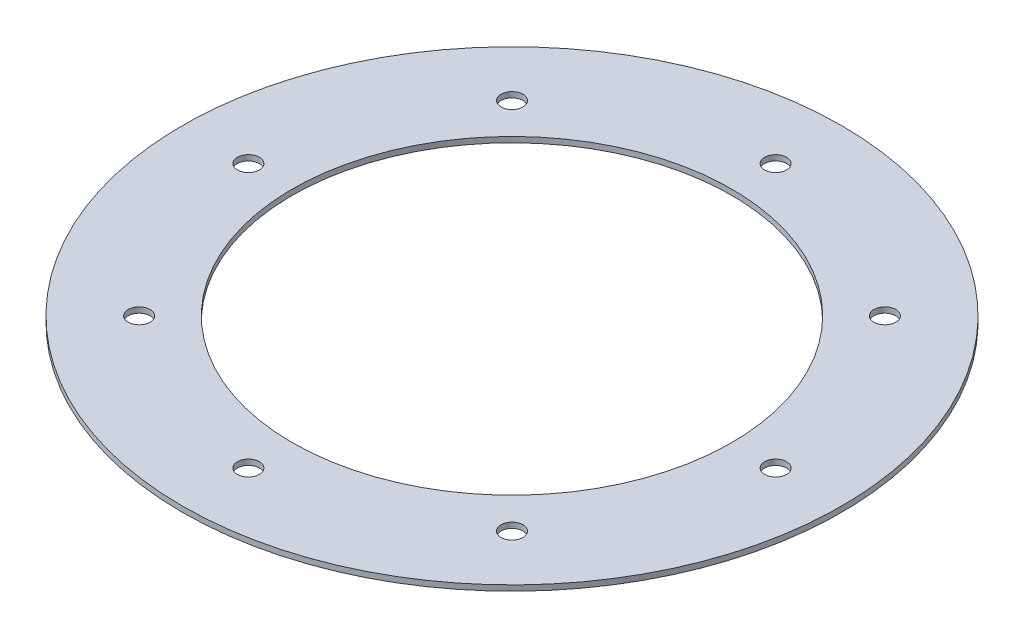
ISO-10303-21;
HEADER;
FILE_DESCRIPTION(('STEP AP214'),'2;1');
FILE_NAME('part.step','',(''),(''),'','','');
FILE_SCHEMA(('AUTOMOTIVE_DESIGN { 1 0 10303 214 1 1 1 1 }'));
ENDSEC;
DATA;
#1=APPLICATION_CONTEXT('core data for automotive mechanical design processes');
#2=APPLICATION_PROTOCOL_DEFINITION('international standard','automotive_design',2000,#1);
#3=PRODUCT_CONTEXT('',#1,'mechanical');
#4=PRODUCT('Part','Part','',(#3));
#5=PRODUCT_RELATED_PRODUCT_CATEGORY('part','',(#4));
#6=PRODUCT_DEFINITION_FORMATION('','',#4);
#7=PRODUCT_DEFINITION_CONTEXT('part definition',#1,'design');
#8=PRODUCT_DEFINITION('design','',#6,#7);
#9=PRODUCT_DEFINITION_SHAPE('','',#8);
#10=(LENGTH_UNIT() NAMED_UNIT(*) SI_UNIT(.MILLI.,.METRE.));
#11=(NAMED_UNIT(*) PLANE_ANGLE_UNIT() SI_UNIT($,.RADIAN.));
#12=(NAMED_UNIT(*) SI_UNIT($,.STERADIAN.) SOLID_ANGLE_UNIT());
#13=UNCERTAINTY_MEASURE_WITH_UNIT(LENGTH_MEASURE(1.E-05),#10,'distance_accuracy_value','');
#14=(GEOMETRIC_REPRESENTATION_CONTEXT(3) GLOBAL_UNCERTAINTY_ASSIGNED_CONTEXT((#13)) GLOBAL_UNIT_ASSIGNED_CONTEXT((#10,
#11,#12)) REPRESENTATION_CONTEXT('',''));
#15=CARTESIAN_POINT('',(0.,0.,0.));
#16=DIRECTION('',(0.,0.,1.));
#17=DIRECTION('',(1.,0.,0.));
#18=AXIS2_PLACEMENT_3D('',#15,#16,#17);
#19=CARTESIAN_POINT('',(0.,1.,0.));
#20=DIRECTION('',(0.,1.,0.));
#21=DIRECTION('',(0.,0.,1.));
#22=AXIS2_PLACEMENT_3D('',#19,#20,#21);
#23=PLANE('',#22);
#24=CARTESIAN_POINT('',(-47.999999999998,1.,2.04342392667114E-12));
#25=DIRECTION('',(0.,1.,0.));
#26=DIRECTION('',(0.,0.,1.));
#27=AXIS2_PLACEMENT_3D('',#24,#25,#26);
#28=CIRCLE('',#27,2.00000000000303);
#29=CARTESIAN_POINT('',(-47.999999999998,1.,2.00000000000507));
#30=VERTEX_POINT('',#29);
#31=EDGE_CURVE('E108',#30,#30,#28,.T.);
#32=ORIENTED_EDGE('',*,*,#31,.F.);
#33=EDGE_LOOP('',(#32));
#34=FACE_BOUND('',#33,.T.);
#35=CARTESIAN_POINT('',(4.07509124407046E-12,1.,48.));
#36=DIRECTION('',(0.,1.,0.));
#37=DIRECTION('',(0.,0.,1.));
#38=AXIS2_PLACEMENT_3D('',#35,#36,#37);
#39=CIRCLE('',#38,2.00000000000422);
#40=CARTESIAN_POINT('',(4.07509124407046E-12,1.,50.0000000000042));
#41=VERTEX_POINT('',#40);
#42=EDGE_CURVE('E92',#41,#41,#39,.T.);
#43=ORIENTED_EDGE('',*,*,#42,.F.);
#44=EDGE_LOOP('',(#43));
#45=FACE_BOUND('',#44,.T.);
#46=CARTESIAN_POINT('',(48.000000000002,1.,-2.03754562203523E-12));
#47=DIRECTION('',(0.,1.,0.));
#48=DIRECTION('',(0.,0.,1.));
#49=AXIS2_PLACEMENT_3D('',#46,#47,#48);
#50=CIRCLE('',#49,2.00000000000152);
#51=CARTESIAN_POINT('',(48.000000000002,1.,1.99999999999948));
#52=VERTEX_POINT('',#51);
#53=EDGE_CURVE('E76',#52,#52,#50,.T.);
#54=ORIENTED_EDGE('',*,*,#53,.F.);
#55=EDGE_LOOP('',(#54));
#56=FACE_BOUND('',#55,.T.);
#57=CARTESIAN_POINT('',(0.,1.,0.));
#58=DIRECTION('',(0.,1.,0.));
#59=DIRECTION('',(0.,0.,1.));
#60=AXIS2_PLACEMENT_3D('',#57,#58,#59);
#61=CIRCLE('',#60,40.);
#62=CARTESIAN_POINT('',(0.,1.,40.));
#63=VERTEX_POINT('',#62);
#64=EDGE_CURVE('E60',#63,#63,#61,.T.);
#65=ORIENTED_EDGE('',*,*,#64,.F.);
#66=EDGE_LOOP('',(#65));
#67=FACE_BOUND('',#66,.T.);
#68=CARTESIAN_POINT('',(0.,1.,0.));
#69=DIRECTION('',(0.,1.,0.));
#70=DIRECTION('',(0.,0.,1.));
#71=AXIS2_PLACEMENT_3D('',#68,#69,#70);
#72=CIRCLE('',#71,60.);
#73=CARTESIAN_POINT('',(0.,1.,60.));
#74=VERTEX_POINT('',#73);
#75=EDGE_CURVE('E10',#74,#74,#72,.T.);
#76=ORIENTED_EDGE('',*,*,#75,.T.);
#77=EDGE_LOOP('',(#76));
#78=FACE_BOUND('',#77,.T.);
#79=CARTESIAN_POINT('',(0.,1.,-48.));
#80=DIRECTION('',(0.,1.,0.));
#81=DIRECTION('',(0.,0.,1.));
#82=AXIS2_PLACEMENT_3D('',#79,#80,#81);
#83=CIRCLE('',#82,2.);
#84=CARTESIAN_POINT('',(0.,1.,-46.));
#85=VERTEX_POINT('',#84);
#86=EDGE_CURVE('E54',#85,#85,#83,.T.);
#87=ORIENTED_EDGE('',*,*,#86,.F.);
#88=EDGE_LOOP('',(#87));
#89=FACE_BOUND('',#88,.T.);
#90=CARTESIAN_POINT('',(33.9411254969549,1.,-33.9411254969557));
#91=DIRECTION('',(0.,1.,0.));
#92=DIRECTION('',(0.,0.,1.));
#93=AXIS2_PLACEMENT_3D('',#90,#91,#92);
#94=CIRCLE('',#93,2.00000000000024);
#95=CARTESIAN_POINT('',(33.9411254969549,1.,-31.9411254969555));
#96=VERTEX_POINT('',#95);
#97=EDGE_CURVE('E68',#96,#96,#94,.T.);
#98=ORIENTED_EDGE('',*,*,#97,.F.);
#99=EDGE_LOOP('',(#98));
#100=FACE_BOUND('',#99,.T.);
#101=CARTESIAN_POINT('',(33.9411254969578,1.,33.9411254969528));
#102=DIRECTION('',(0.,1.,0.));
#103=DIRECTION('',(0.,0.,1.));
#104=AXIS2_PLACEMENT_3D('',#101,#102,#103);
#105=CIRCLE('',#104,2.00000000000314);
#106=CARTESIAN_POINT('',(33.9411254969578,1.,35.941125496956));
#107=VERTEX_POINT('',#106);
#108=EDGE_CURVE('E84',#107,#107,#105,.T.);
#109=ORIENTED_EDGE('',*,*,#108,.F.);
#110=EDGE_LOOP('',(#109));
#111=FACE_BOUND('',#110,.T.);
#112=CARTESIAN_POINT('',(-33.9411254969508,1.,33.9411254969557));
#113=DIRECTION('',(0.,1.,0.));
#114=DIRECTION('',(0.,0.,1.));
#115=AXIS2_PLACEMENT_3D('',#112,#113,#114);
#116=CIRCLE('',#115,2.00000000000416);
#117=CARTESIAN_POINT('',(-33.9411254969508,1.,35.9411254969599));
#118=VERTEX_POINT('',#117);
#119=EDGE_CURVE('E100',#118,#118,#116,.T.);
#120=ORIENTED_EDGE('',*,*,#119,.F.);
#121=EDGE_LOOP('',(#120));
#122=FACE_BOUND('',#121,.T.);
#123=CARTESIAN_POINT('',(-33.9411254969537,1.,-33.9411254969528));
#124=DIRECTION('',(0.,1.,0.));
#125=DIRECTION('',(0.,0.,1.));
#126=AXIS2_PLACEMENT_3D('',#123,#124,#125);
#127=CIRCLE('',#126,2.00000000000156);
#128=CARTESIAN_POINT('',(-33.9411254969537,1.,-31.9411254969513));
#129=VERTEX_POINT('',#128);
#130=EDGE_CURVE('E116',#129,#129,#127,.T.);
#131=ORIENTED_EDGE('',*,*,#130,.F.);
#132=EDGE_LOOP('',(#131));
#133=FACE_BOUND('',#132,.T.);
#134=ADVANCED_FACE('F41',(#34,#45,#56,#67,#78,#89,#100,#111,#122,#133),#23,.T.);
#135=CARTESIAN_POINT('',(0.,0.,0.));
#136=DIRECTION('',(0.,1.,0.));
#137=DIRECTION('',(0.,0.,1.));
#138=AXIS2_PLACEMENT_3D('',#135,#136,#137);
#139=PLANE('',#138);
#140=CARTESIAN_POINT('',(0.,0.,0.));
#141=DIRECTION('',(0.,1.,0.));
#142=DIRECTION('',(0.,0.,1.));
#143=AXIS2_PLACEMENT_3D('',#140,#141,#142);
#144=CIRCLE('',#143,60.);
#145=CARTESIAN_POINT('',(0.,0.,60.));
#146=VERTEX_POINT('',#145);
#147=EDGE_CURVE('E45',#146,#146,#144,.T.);
#148=ORIENTED_EDGE('',*,*,#147,.F.);
#149=EDGE_LOOP('',(#148));
#150=FACE_BOUND('',#149,.T.);
#151=CARTESIAN_POINT('',(0.,0.,-48.));
#152=DIRECTION('',(0.,1.,0.));
#153=DIRECTION('',(0.,0.,1.));
#154=AXIS2_PLACEMENT_3D('',#151,#152,#153);
#155=CIRCLE('',#154,2.);
#156=CARTESIAN_POINT('',(0.,0.,-46.));
#157=VERTEX_POINT('',#156);
#158=EDGE_CURVE('E56',#157,#157,#155,.T.);
#159=ORIENTED_EDGE('',*,*,#158,.T.);
#160=EDGE_LOOP('',(#159));
#161=FACE_BOUND('',#160,.T.);
#162=CARTESIAN_POINT('',(0.,0.,0.));
#163=DIRECTION('',(0.,1.,0.));
#164=DIRECTION('',(0.,0.,1.));
#165=AXIS2_PLACEMENT_3D('',#162,#163,#164);
#166=CIRCLE('',#165,40.);
#167=CARTESIAN_POINT('',(0.,0.,40.));
#168=VERTEX_POINT('',#167);
#169=EDGE_CURVE('E64',#168,#168,#166,.T.);
#170=ORIENTED_EDGE('',*,*,#169,.T.);
#171=EDGE_LOOP('',(#170));
#172=FACE_BOUND('',#171,.T.);
#173=CARTESIAN_POINT('',(33.9411254969549,0.,-33.9411254969557));
#174=DIRECTION('',(0.,1.,0.));
#175=DIRECTION('',(0.,0.,1.));
#176=AXIS2_PLACEMENT_3D('',#173,#174,#175);
#177=CIRCLE('',#176,2.00000000000024);
#178=CARTESIAN_POINT('',(33.9411254969549,0.,-31.9411254969555));
#179=VERTEX_POINT('',#178);
#180=EDGE_CURVE('E72',#179,#179,#177,.T.);
#181=ORIENTED_EDGE('',*,*,#180,.T.);
#182=EDGE_LOOP('',(#181));
#183=FACE_BOUND('',#182,.T.);
#184=CARTESIAN_POINT('',(48.000000000002,0.,-2.03754562203523E-12));
#185=DIRECTION('',(0.,1.,0.));
#186=DIRECTION('',(0.,0.,1.));
#187=AXIS2_PLACEMENT_3D('',#184,#185,#186);
#188=CIRCLE('',#187,2.00000000000152);
#189=CARTESIAN_POINT('',(48.000000000002,0.,1.99999999999948));
#190=VERTEX_POINT('',#189);
#191=EDGE_CURVE('E80',#190,#190,#188,.T.);
#192=ORIENTED_EDGE('',*,*,#191,.T.);
#193=EDGE_LOOP('',(#192));
#194=FACE_BOUND('',#193,.T.);
#195=CARTESIAN_POINT('',(33.9411254969578,0.,33.9411254969528));
#196=DIRECTION('',(0.,1.,0.));
#197=DIRECTION('',(0.,0.,1.));
#198=AXIS2_PLACEMENT_3D('',#195,#196,#197);
#199=CIRCLE('',#198,2.00000000000314);
#200=CARTESIAN_POINT('',(33.9411254969578,0.,35.941125496956));
#201=VERTEX_POINT('',#200);
#202=EDGE_CURVE('E88',#201,#201,#199,.T.);
#203=ORIENTED_EDGE('',*,*,#202,.T.);
#204=EDGE_LOOP('',(#203));
#205=FACE_BOUND('',#204,.T.);
#206=CARTESIAN_POINT('',(4.07509124407046E-12,0.,48.));
#207=DIRECTION('',(0.,1.,0.));
#208=DIRECTION('',(0.,0.,1.));
#209=AXIS2_PLACEMENT_3D('',#206,#207,#208);
#210=CIRCLE('',#209,2.00000000000422);
#211=CARTESIAN_POINT('',(4.07509124407046E-12,0.,50.0000000000042));
#212=VERTEX_POINT('',#211);
#213=EDGE_CURVE('E96',#212,#212,#210,.T.);
#214=ORIENTED_EDGE('',*,*,#213,.T.);
#215=EDGE_LOOP('',(#214));
#216=FACE_BOUND('',#215,.T.);
#217=CARTESIAN_POINT('',(-33.9411254969508,0.,33.9411254969557));
#218=DIRECTION('',(0.,1.,0.));
#219=DIRECTION('',(0.,0.,1.));
#220=AXIS2_PLACEMENT_3D('',#217,#218,#219);
#221=CIRCLE('',#220,2.00000000000416);
#222=CARTESIAN_POINT('',(-33.9411254969508,0.,35.9411254969599));
#223=VERTEX_POINT('',#222);
#224=EDGE_CURVE('E104',#223,#223,#221,.T.);
#225=ORIENTED_EDGE('',*,*,#224,.T.);
#226=EDGE_LOOP('',(#225));
#227=FACE_BOUND('',#226,.T.);
#228=CARTESIAN_POINT('',(-47.999999999998,0.,2.04342392667114E-12));
#229=DIRECTION('',(0.,1.,0.));
#230=DIRECTION('',(0.,0.,1.));
#231=AXIS2_PLACEMENT_3D('',#228,#229,#230);
#232=CIRCLE('',#231,2.00000000000303);
#233=CARTESIAN_POINT('',(-47.999999999998,0.,2.00000000000507));
#234=VERTEX_POINT('',#233);
#235=EDGE_CURVE('E112',#234,#234,#232,.T.);
#236=ORIENTED_EDGE('',*,*,#235,.T.);
#237=EDGE_LOOP('',(#236));
#238=FACE_BOUND('',#237,.T.);
#239=CARTESIAN_POINT('',(-33.9411254969537,0.,-33.9411254969528));
#240=DIRECTION('',(0.,1.,0.));
#241=DIRECTION('',(0.,0.,1.));
#242=AXIS2_PLACEMENT_3D('',#239,#240,#241);
#243=CIRCLE('',#242,2.00000000000156);
#244=CARTESIAN_POINT('',(-33.9411254969537,0.,-31.9411254969513));
#245=VERTEX_POINT('',#244);
#246=EDGE_CURVE('E120',#245,#245,#243,.T.);
#247=ORIENTED_EDGE('',*,*,#246,.T.);
#248=EDGE_LOOP('',(#247));
#249=FACE_BOUND('',#248,.T.);
#250=ADVANCED_FACE('F132',(#150,#161,#172,#183,#194,#205,#216,#227,#238,#249),#139,.F.);
#251=CARTESIAN_POINT('',(0.,1.,0.));
#252=DIRECTION('',(0.,-1.,0.));
#253=DIRECTION('',(0.,0.,-1.));
#254=AXIS2_PLACEMENT_3D('',#251,#252,#253);
#255=CYLINDRICAL_SURFACE('',#254,60.);
#256=ORIENTED_EDGE('',*,*,#75,.F.);
#257=EDGE_LOOP('',(#256));
#258=FACE_BOUND('',#257,.T.);
#259=ORIENTED_EDGE('',*,*,#147,.T.);
#260=EDGE_LOOP('',(#259));
#261=FACE_BOUND('',#260,.T.);
#262=ADVANCED_FACE('F43',(#258,#261),#255,.T.);
#263=CARTESIAN_POINT('',(0.,1.,-48.));
#264=DIRECTION('',(0.,-1.,0.));
#265=DIRECTION('',(0.,0.,-1.));
#266=AXIS2_PLACEMENT_3D('',#263,#264,#265);
#267=CYLINDRICAL_SURFACE('',#266,2.);
#268=ORIENTED_EDGE('',*,*,#86,.T.);
#269=EDGE_LOOP('',(#268));
#270=FACE_BOUND('',#269,.T.);
#271=ORIENTED_EDGE('',*,*,#158,.F.);
#272=EDGE_LOOP('',(#271));
#273=FACE_BOUND('',#272,.T.);
#274=ADVANCED_FACE('F142',(#270,#273),#267,.F.);
#275=CARTESIAN_POINT('',(0.,1.,0.));
#276=DIRECTION('',(0.,-1.,0.));
#277=DIRECTION('',(0.,0.,-1.));
#278=AXIS2_PLACEMENT_3D('',#275,#276,#277);
#279=CYLINDRICAL_SURFACE('',#278,40.);
#280=ORIENTED_EDGE('',*,*,#64,.T.);
#281=EDGE_LOOP('',(#280));
#282=FACE_BOUND('',#281,.T.);
#283=ORIENTED_EDGE('',*,*,#169,.F.);
#284=EDGE_LOOP('',(#283));
#285=FACE_BOUND('',#284,.T.);
#286=ADVANCED_FACE('F145',(#282,#285),#279,.F.);
#287=CARTESIAN_POINT('',(33.9411254969549,1.,-33.9411254969557));
#288=DIRECTION('',(0.,-1.,0.));
#289=DIRECTION('',(0.,0.,-1.));
#290=AXIS2_PLACEMENT_3D('',#287,#288,#289);
#291=CYLINDRICAL_SURFACE('',#290,2.00000000000024);
#292=ORIENTED_EDGE('',*,*,#97,.T.);
#293=EDGE_LOOP('',(#292));
#294=FACE_BOUND('',#293,.T.);
#295=ORIENTED_EDGE('',*,*,#180,.F.);
#296=EDGE_LOOP('',(#295));
#297=FACE_BOUND('',#296,.T.);
#298=ADVANCED_FACE('F149',(#294,#297),#291,.F.);
#299=CARTESIAN_POINT('',(48.000000000002,1.,-2.03754562203523E-12));
#300=DIRECTION('',(0.,-1.,0.));
#301=DIRECTION('',(0.,0.,-1.));
#302=AXIS2_PLACEMENT_3D('',#299,#300,#301);
#303=CYLINDRICAL_SURFACE('',#302,2.00000000000152);
#304=ORIENTED_EDGE('',*,*,#53,.T.);
#305=EDGE_LOOP('',(#304));
#306=FACE_BOUND('',#305,.T.);
#307=ORIENTED_EDGE('',*,*,#191,.F.);
#308=EDGE_LOOP('',(#307));
#309=FACE_BOUND('',#308,.T.);
#310=ADVANCED_FACE('F153',(#306,#309),#303,.F.);
#311=CARTESIAN_POINT('',(33.9411254969578,1.,33.9411254969528));
#312=DIRECTION('',(0.,-1.,0.));
#313=DIRECTION('',(0.,0.,-1.));
#314=AXIS2_PLACEMENT_3D('',#311,#312,#313);
#315=CYLINDRICAL_SURFACE('',#314,2.00000000000314);
#316=ORIENTED_EDGE('',*,*,#108,.T.);
#317=EDGE_LOOP('',(#316));
#318=FACE_BOUND('',#317,.T.);
#319=ORIENTED_EDGE('',*,*,#202,.F.);
#320=EDGE_LOOP('',(#319));
#321=FACE_BOUND('',#320,.T.);
#322=ADVANCED_FACE('F157',(#318,#321),#315,.F.);
#323=CARTESIAN_POINT('',(4.07509124407046E-12,1.,48.));
#324=DIRECTION('',(0.,-1.,0.));
#325=DIRECTION('',(0.,0.,-1.));
#326=AXIS2_PLACEMENT_3D('',#323,#324,#325);
#327=CYLINDRICAL_SURFACE('',#326,2.00000000000422);
#328=ORIENTED_EDGE('',*,*,#42,.T.);
#329=EDGE_LOOP('',(#328));
#330=FACE_BOUND('',#329,.T.);
#331=ORIENTED_EDGE('',*,*,#213,.F.);
#332=EDGE_LOOP('',(#331));
#333=FACE_BOUND('',#332,.T.);
#334=ADVANCED_FACE('F161',(#330,#333),#327,.F.);
#335=CARTESIAN_POINT('',(-33.9411254969508,1.,33.9411254969557));
#336=DIRECTION('',(0.,-1.,0.));
#337=DIRECTION('',(0.,0.,-1.));
#338=AXIS2_PLACEMENT_3D('',#335,#336,#337);
#339=CYLINDRICAL_SURFACE('',#338,2.00000000000416);
#340=ORIENTED_EDGE('',*,*,#119,.T.);
#341=EDGE_LOOP('',(#340));
#342=FACE_BOUND('',#341,.T.);
#343=ORIENTED_EDGE('',*,*,#224,.F.);
#344=EDGE_LOOP('',(#343));
#345=FACE_BOUND('',#344,.T.);
#346=ADVANCED_FACE('F165',(#342,#345),#339,.F.);
#347=CARTESIAN_POINT('',(-47.999999999998,1.,2.04342392667114E-12));
#348=DIRECTION('',(0.,-1.,0.));
#349=DIRECTION('',(0.,0.,-1.));
#350=AXIS2_PLACEMENT_3D('',#347,#348,#349);
#351=CYLINDRICAL_SURFACE('',#350,2.00000000000303);
#352=ORIENTED_EDGE('',*,*,#31,.T.);
#353=EDGE_LOOP('',(#352));
#354=FACE_BOUND('',#353,.T.);
#355=ORIENTED_EDGE('',*,*,#235,.F.);
#356=EDGE_LOOP('',(#355));
#357=FACE_BOUND('',#356,.T.);
#358=ADVANCED_FACE('F169',(#354,#357),#351,.F.);
#359=CARTESIAN_POINT('',(-33.9411254969537,1.,-33.9411254969528));
#360=DIRECTION('',(0.,-1.,0.));
#361=DIRECTION('',(0.,0.,-1.));
#362=AXIS2_PLACEMENT_3D('',#359,#360,#361);
#363=CYLINDRICAL_SURFACE('',#362,2.00000000000156);
#364=ORIENTED_EDGE('',*,*,#130,.T.);
#365=EDGE_LOOP('',(#364));
#366=FACE_BOUND('',#365,.T.);
#367=ORIENTED_EDGE('',*,*,#246,.F.);
#368=EDGE_LOOP('',(#367));
#369=FACE_BOUND('',#368,.T.);
#370=ADVANCED_FACE('F128',(#366,#369),#363,.F.);
#371=CLOSED_SHELL('',(#134,#250,#262,#274,#286,#298,#310,#322,#334,#346,#358,#370));
#372=MANIFOLD_SOLID_BREP('B2',#371);
#373=ADVANCED_BREP_SHAPE_REPRESENTATION('',(#18,#372),#14);
#374=SHAPE_DEFINITION_REPRESENTATION(#9,#373);
ENDSEC;
END-ISO-10303-21;
